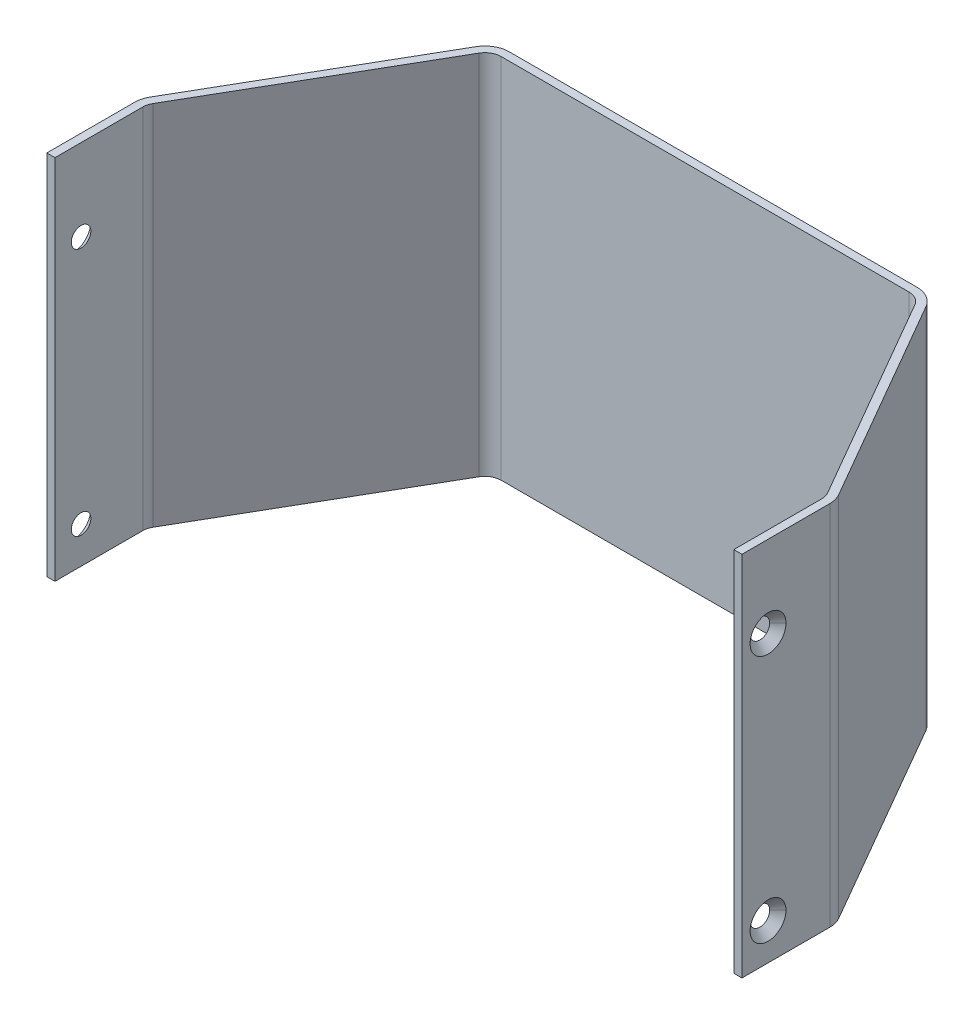
ISO-10303-21;
HEADER;
FILE_DESCRIPTION(('STEP AP214'),'2;1');
FILE_NAME('part.step','',(''),(''),'','','');
FILE_SCHEMA(('AUTOMOTIVE_DESIGN { 1 0 10303 214 1 1 1 1 }'));
ENDSEC;
DATA;
#1=APPLICATION_CONTEXT('core data for automotive mechanical design processes');
#2=APPLICATION_PROTOCOL_DEFINITION('international standard','automotive_design',2000,#1);
#3=PRODUCT_CONTEXT('',#1,'mechanical');
#4=PRODUCT('Part','Part','',(#3));
#5=PRODUCT_RELATED_PRODUCT_CATEGORY('part','',(#4));
#6=PRODUCT_DEFINITION_FORMATION('','',#4);
#7=PRODUCT_DEFINITION_CONTEXT('part definition',#1,'design');
#8=PRODUCT_DEFINITION('design','',#6,#7);
#9=PRODUCT_DEFINITION_SHAPE('','',#8);
#10=(LENGTH_UNIT() NAMED_UNIT(*) SI_UNIT(.MILLI.,.METRE.));
#11=(NAMED_UNIT(*) PLANE_ANGLE_UNIT() SI_UNIT($,.RADIAN.));
#12=(NAMED_UNIT(*) SI_UNIT($,.STERADIAN.) SOLID_ANGLE_UNIT());
#13=UNCERTAINTY_MEASURE_WITH_UNIT(LENGTH_MEASURE(1.E-05),#10,'distance_accuracy_value','');
#14=(GEOMETRIC_REPRESENTATION_CONTEXT(3) GLOBAL_UNCERTAINTY_ASSIGNED_CONTEXT((#13)) GLOBAL_UNIT_ASSIGNED_CONTEXT((#10,
#11,#12)) REPRESENTATION_CONTEXT('',''));
#15=CARTESIAN_POINT('',(0.,0.,0.));
#16=DIRECTION('',(0.,0.,1.));
#17=DIRECTION('',(1.,0.,0.));
#18=AXIS2_PLACEMENT_3D('',#15,#16,#17);
#19=CARTESIAN_POINT('',(42.625,35.,34.4));
#20=DIRECTION('',(1.,0.,0.));
#21=DIRECTION('',(0.,0.,-1.));
#22=AXIS2_PLACEMENT_3D('',#19,#20,#21);
#23=CONICAL_SURFACE('',#22,2.2,0.785398163397452);
#24=CARTESIAN_POINT('',(41.625,35.,34.4));
#25=DIRECTION('',(1.,0.,0.));
#26=DIRECTION('',(0.,0.,-1.));
#27=AXIS2_PLACEMENT_3D('',#24,#25,#26);
#28=CIRCLE('',#27,1.2);
#29=CARTESIAN_POINT('',(41.625,35.,35.6));
#30=VERTEX_POINT('',#29);
#31=CARTESIAN_POINT('',(41.625,35.,33.2));
#32=VERTEX_POINT('',#31);
#33=EDGE_CURVE('E41',#30,#32,#28,.T.);
#34=ORIENTED_EDGE('',*,*,#33,.F.);
#35=DIRECTION('',(0.707106781186545,0.,0.70710678118655));
#36=VECTOR('',#35,1.);
#37=CARTESIAN_POINT('',(42.625,35.,36.6));
#38=LINE('',#37,#36);
#39=CARTESIAN_POINT('',(42.625,35.,36.6));
#40=VERTEX_POINT('',#39);
#41=EDGE_CURVE('E11',#30,#40,#38,.T.);
#42=ORIENTED_EDGE('',*,*,#41,.T.);
#43=CARTESIAN_POINT('',(42.625,35.,34.4));
#44=DIRECTION('',(1.,0.,0.));
#45=DIRECTION('',(0.,0.,-1.));
#46=AXIS2_PLACEMENT_3D('',#43,#44,#45);
#47=CIRCLE('',#46,2.2);
#48=CARTESIAN_POINT('',(42.625,35.,32.2));
#49=VERTEX_POINT('',#48);
#50=EDGE_CURVE('E27',#40,#49,#47,.T.);
#51=ORIENTED_EDGE('',*,*,#50,.T.);
#52=DIRECTION('',(0.707106781186545,0.,-0.70710678118655));
#53=VECTOR('',#52,1.);
#54=CARTESIAN_POINT('',(42.625,35.,32.2));
#55=LINE('',#54,#53);
#56=EDGE_CURVE('E459',#32,#49,#55,.T.);
#57=ORIENTED_EDGE('',*,*,#56,.F.);
#58=EDGE_LOOP('',(#34,#42,#51,#57));
#59=FACE_BOUND('',#58,.T.);
#60=ADVANCED_FACE('F16',(#59),#23,.F.);
#61=CARTESIAN_POINT('',(42.625,4.5,34.4));
#62=DIRECTION('',(1.,0.,0.));
#63=DIRECTION('',(0.,0.,-1.));
#64=AXIS2_PLACEMENT_3D('',#61,#62,#63);
#65=CONICAL_SURFACE('',#64,2.2,0.785398163397453);
#66=CARTESIAN_POINT('',(41.625,4.5,34.4));
#67=DIRECTION('',(1.,0.,0.));
#68=DIRECTION('',(0.,0.,-1.));
#69=AXIS2_PLACEMENT_3D('',#66,#67,#68);
#70=CIRCLE('',#69,1.2);
#71=CARTESIAN_POINT('',(41.625,4.5,35.6));
#72=VERTEX_POINT('',#71);
#73=CARTESIAN_POINT('',(41.625,4.5,33.2));
#74=VERTEX_POINT('',#73);
#75=EDGE_CURVE('E350',#72,#74,#70,.T.);
#76=ORIENTED_EDGE('',*,*,#75,.F.);
#77=DIRECTION('',(0.707106781186544,0.,0.707106781186551));
#78=VECTOR('',#77,1.);
#79=CARTESIAN_POINT('',(42.625,4.5,36.6));
#80=LINE('',#79,#78);
#81=CARTESIAN_POINT('',(42.625,4.5,36.6));
#82=VERTEX_POINT('',#81);
#83=EDGE_CURVE('E356',#72,#82,#80,.T.);
#84=ORIENTED_EDGE('',*,*,#83,.T.);
#85=CARTESIAN_POINT('',(42.625,4.5,34.4));
#86=DIRECTION('',(1.,0.,0.));
#87=DIRECTION('',(0.,0.,-1.));
#88=AXIS2_PLACEMENT_3D('',#85,#86,#87);
#89=CIRCLE('',#88,2.2);
#90=CARTESIAN_POINT('',(42.625,4.5,32.2));
#91=VERTEX_POINT('',#90);
#92=EDGE_CURVE('E352',#82,#91,#89,.T.);
#93=ORIENTED_EDGE('',*,*,#92,.T.);
#94=DIRECTION('',(0.707106781186544,0.,-0.707106781186551));
#95=VECTOR('',#94,1.);
#96=CARTESIAN_POINT('',(42.625,4.5,32.2));
#97=LINE('',#96,#95);
#98=EDGE_CURVE('E391',#74,#91,#97,.T.);
#99=ORIENTED_EDGE('',*,*,#98,.F.);
#100=EDGE_LOOP('',(#76,#84,#93,#99));
#101=FACE_BOUND('',#100,.T.);
#102=ADVANCED_FACE('F857',(#101),#65,.F.);
#103=CARTESIAN_POINT('',(-42.625,35.,34.4));
#104=DIRECTION('',(-1.,0.,0.));
#105=DIRECTION('',(0.,0.,1.));
#106=AXIS2_PLACEMENT_3D('',#103,#104,#105);
#107=CONICAL_SURFACE('',#106,2.2,0.785398163397448);
#108=CARTESIAN_POINT('',(-41.625,35.,34.4));
#109=DIRECTION('',(-1.,0.,0.));
#110=DIRECTION('',(0.,0.,1.));
#111=AXIS2_PLACEMENT_3D('',#108,#109,#110);
#112=CIRCLE('',#111,1.2);
#113=CARTESIAN_POINT('',(-41.625,35.,33.2));
#114=VERTEX_POINT('',#113);
#115=CARTESIAN_POINT('',(-41.625,35.,35.6));
#116=VERTEX_POINT('',#115);
#117=EDGE_CURVE('E340',#114,#116,#112,.T.);
#118=ORIENTED_EDGE('',*,*,#117,.F.);
#119=DIRECTION('',(-0.707106781186547,0.,-0.707106781186548));
#120=VECTOR('',#119,1.);
#121=CARTESIAN_POINT('',(-42.625,35.,32.2));
#122=LINE('',#121,#120);
#123=CARTESIAN_POINT('',(-42.625,35.,32.2));
#124=VERTEX_POINT('',#123);
#125=EDGE_CURVE('E357',#114,#124,#122,.T.);
#126=ORIENTED_EDGE('',*,*,#125,.T.);
#127=CARTESIAN_POINT('',(-42.625,35.,34.4));
#128=DIRECTION('',(-1.,0.,0.));
#129=DIRECTION('',(0.,0.,1.));
#130=AXIS2_PLACEMENT_3D('',#127,#128,#129);
#131=CIRCLE('',#130,2.2);
#132=CARTESIAN_POINT('',(-42.625,35.,36.6));
#133=VERTEX_POINT('',#132);
#134=EDGE_CURVE('E405',#124,#133,#131,.T.);
#135=ORIENTED_EDGE('',*,*,#134,.T.);
#136=DIRECTION('',(-0.707106781186548,0.,0.707106781186547));
#137=VECTOR('',#136,1.);
#138=CARTESIAN_POINT('',(-42.625,35.,36.6));
#139=LINE('',#138,#137);
#140=EDGE_CURVE('E335',#116,#133,#139,.T.);
#141=ORIENTED_EDGE('',*,*,#140,.F.);
#142=EDGE_LOOP('',(#118,#126,#135,#141));
#143=FACE_BOUND('',#142,.T.);
#144=ADVANCED_FACE('F861',(#143),#107,.F.);
#145=CARTESIAN_POINT('',(-42.625,4.5,34.4));
#146=DIRECTION('',(-1.,0.,0.));
#147=DIRECTION('',(0.,0.,1.));
#148=AXIS2_PLACEMENT_3D('',#145,#146,#147);
#149=CONICAL_SURFACE('',#148,2.2,0.785398163397448);
#150=CARTESIAN_POINT('',(-41.625,4.5,34.4));
#151=DIRECTION('',(-1.,0.,0.));
#152=DIRECTION('',(0.,0.,1.));
#153=AXIS2_PLACEMENT_3D('',#150,#151,#152);
#154=CIRCLE('',#153,1.2);
#155=CARTESIAN_POINT('',(-41.625,4.5,33.2));
#156=VERTEX_POINT('',#155);
#157=CARTESIAN_POINT('',(-41.625,4.5,35.6));
#158=VERTEX_POINT('',#157);
#159=EDGE_CURVE('E306',#156,#158,#154,.T.);
#160=ORIENTED_EDGE('',*,*,#159,.F.);
#161=DIRECTION('',(-0.707106781186547,0.,-0.707106781186548));
#162=VECTOR('',#161,1.);
#163=CARTESIAN_POINT('',(-42.625,4.5,32.2));
#164=LINE('',#163,#162);
#165=CARTESIAN_POINT('',(-42.625,4.5,32.2));
#166=VERTEX_POINT('',#165);
#167=EDGE_CURVE('E413',#156,#166,#164,.T.);
#168=ORIENTED_EDGE('',*,*,#167,.T.);
#169=CARTESIAN_POINT('',(-42.625,4.5,34.4));
#170=DIRECTION('',(-1.,0.,0.));
#171=DIRECTION('',(0.,0.,1.));
#172=AXIS2_PLACEMENT_3D('',#169,#170,#171);
#173=CIRCLE('',#172,2.2);
#174=CARTESIAN_POINT('',(-42.625,4.5,36.6));
#175=VERTEX_POINT('',#174);
#176=EDGE_CURVE('E466',#166,#175,#173,.T.);
#177=ORIENTED_EDGE('',*,*,#176,.T.);
#178=DIRECTION('',(-0.707106781186548,0.,0.707106781186547));
#179=VECTOR('',#178,1.);
#180=CARTESIAN_POINT('',(-42.625,4.5,36.6));
#181=LINE('',#180,#179);
#182=EDGE_CURVE('E334',#158,#175,#181,.T.);
#183=ORIENTED_EDGE('',*,*,#182,.F.);
#184=EDGE_LOOP('',(#160,#168,#177,#183));
#185=FACE_BOUND('',#184,.T.);
#186=ADVANCED_FACE('F908',(#185),#149,.F.);
#187=CARTESIAN_POINT('',(-42.625,45.,26.831243060695));
#188=DIRECTION('',(1.,0.,0.));
#189=DIRECTION('',(0.,0.,1.));
#190=AXIS2_PLACEMENT_3D('',#187,#188,#189);
#191=PLANE('',#190);
#192=DIRECTION('',(0.,0.,1.));
#193=VECTOR('',#192,1.);
#194=CARTESIAN_POINT('',(-42.625,0.,26.831243060695));
#195=LINE('',#194,#193);
#196=CARTESIAN_POINT('',(-42.625,0.,26.831243060695));
#197=VERTEX_POINT('',#196);
#198=CARTESIAN_POINT('',(-42.625,0.,37.6));
#199=VERTEX_POINT('',#198);
#200=EDGE_CURVE('E361',#197,#199,#195,.T.);
#201=ORIENTED_EDGE('',*,*,#200,.T.);
#202=DIRECTION('',(0.,-1.,0.));
#203=VECTOR('',#202,1.);
#204=CARTESIAN_POINT('',(-42.625,45.,37.6));
#205=LINE('',#204,#203);
#206=CARTESIAN_POINT('',(-42.625,45.,37.6));
#207=VERTEX_POINT('',#206);
#208=EDGE_CURVE('E378',#207,#199,#205,.T.);
#209=ORIENTED_EDGE('',*,*,#208,.F.);
#210=DIRECTION('',(0.,0.,1.));
#211=VECTOR('',#210,1.);
#212=CARTESIAN_POINT('',(-42.625,45.,26.831243060695));
#213=LINE('',#212,#211);
#214=CARTESIAN_POINT('',(-42.625,45.,26.831243060695));
#215=VERTEX_POINT('',#214);
#216=EDGE_CURVE('E366',#215,#207,#213,.T.);
#217=ORIENTED_EDGE('',*,*,#216,.F.);
#218=DIRECTION('',(0.,-1.,0.));
#219=VECTOR('',#218,1.);
#220=CARTESIAN_POINT('',(-42.625,45.,26.831243060695));
#221=LINE('',#220,#219);
#222=EDGE_CURVE('E358',#215,#197,#221,.T.);
#223=ORIENTED_EDGE('',*,*,#222,.T.);
#224=EDGE_LOOP('',(#201,#209,#217,#223));
#225=FACE_BOUND('',#224,.T.);
#226=CARTESIAN_POINT('',(-42.625,35.,34.4));
#227=DIRECTION('',(-1.,0.,0.));
#228=DIRECTION('',(0.,0.,1.));
#229=AXIS2_PLACEMENT_3D('',#226,#227,#228);
#230=CIRCLE('',#229,2.2);
#231=EDGE_CURVE('E395',#133,#124,#230,.T.);
#232=ORIENTED_EDGE('',*,*,#231,.F.);
#233=ORIENTED_EDGE('',*,*,#134,.F.);
#234=EDGE_LOOP('',(#232,#233));
#235=FACE_BOUND('',#234,.T.);
#236=CARTESIAN_POINT('',(-42.625,4.5,34.4));
#237=DIRECTION('',(-1.,0.,0.));
#238=DIRECTION('',(0.,0.,1.));
#239=AXIS2_PLACEMENT_3D('',#236,#237,#238);
#240=CIRCLE('',#239,2.2);
#241=EDGE_CURVE('E330',#175,#166,#240,.T.);
#242=ORIENTED_EDGE('',*,*,#241,.F.);
#243=ORIENTED_EDGE('',*,*,#176,.F.);
#244=EDGE_LOOP('',(#242,#243));
#245=FACE_BOUND('',#244,.T.);
#246=ADVANCED_FACE('F605',(#225,#235,#245),#191,.F.);
#247=CARTESIAN_POINT('',(-41.625,45.,37.6));
#248=DIRECTION('',(0.,0.,1.));
#249=DIRECTION('',(1.,0.,0.));
#250=AXIS2_PLACEMENT_3D('',#247,#248,#249);
#251=PLANE('',#250);
#252=DIRECTION('',(-1.,0.,0.));
#253=VECTOR('',#252,1.);
#254=CARTESIAN_POINT('',(-41.625,0.,37.6));
#255=LINE('',#254,#253);
#256=CARTESIAN_POINT('',(-41.625,0.,37.6));
#257=VERTEX_POINT('',#256);
#258=EDGE_CURVE('E399',#257,#199,#255,.T.);
#259=ORIENTED_EDGE('',*,*,#258,.F.);
#260=DIRECTION('',(0.,-1.,0.));
#261=VECTOR('',#260,1.);
#262=CARTESIAN_POINT('',(-41.625,45.,37.6));
#263=LINE('',#262,#261);
#264=CARTESIAN_POINT('',(-41.625,45.,37.6));
#265=VERTEX_POINT('',#264);
#266=EDGE_CURVE('E430',#265,#257,#263,.T.);
#267=ORIENTED_EDGE('',*,*,#266,.F.);
#268=DIRECTION('',(-1.,0.,0.));
#269=VECTOR('',#268,1.);
#270=CARTESIAN_POINT('',(-41.625,45.,37.6));
#271=LINE('',#270,#269);
#272=EDGE_CURVE('E362',#265,#207,#271,.T.);
#273=ORIENTED_EDGE('',*,*,#272,.T.);
#274=ORIENTED_EDGE('',*,*,#208,.T.);
#275=EDGE_LOOP('',(#259,#267,#273,#274));
#276=FACE_BOUND('',#275,.T.);
#277=ADVANCED_FACE('F608',(#276),#251,.T.);
#278=CARTESIAN_POINT('',(-41.625,45.,26.831243060695));
#279=DIRECTION('',(1.,0.,0.));
#280=DIRECTION('',(0.,0.,1.));
#281=AXIS2_PLACEMENT_3D('',#278,#279,#280);
#282=PLANE('',#281);
#283=DIRECTION('',(0.,0.,1.));
#284=VECTOR('',#283,1.);
#285=CARTESIAN_POINT('',(-41.625,0.,26.831243060695));
#286=LINE('',#285,#284);
#287=CARTESIAN_POINT('',(-41.625,0.,26.831243060695));
#288=VERTEX_POINT('',#287);
#289=EDGE_CURVE('E493',#288,#257,#286,.T.);
#290=ORIENTED_EDGE('',*,*,#289,.F.);
#291=DIRECTION('',(0.,-1.,0.));
#292=VECTOR('',#291,1.);
#293=CARTESIAN_POINT('',(-41.625,45.,26.831243060695));
#294=LINE('',#293,#292);
#295=CARTESIAN_POINT('',(-41.625,45.,26.831243060695));
#296=VERTEX_POINT('',#295);
#297=EDGE_CURVE('E307',#296,#288,#294,.T.);
#298=ORIENTED_EDGE('',*,*,#297,.F.);
#299=DIRECTION('',(0.,0.,1.));
#300=VECTOR('',#299,1.);
#301=CARTESIAN_POINT('',(-41.625,45.,26.831243060695));
#302=LINE('',#301,#300);
#303=EDGE_CURVE('E381',#296,#265,#302,.T.);
#304=ORIENTED_EDGE('',*,*,#303,.T.);
#305=ORIENTED_EDGE('',*,*,#266,.T.);
#306=EDGE_LOOP('',(#290,#298,#304,#305));
#307=FACE_BOUND('',#306,.T.);
#308=CARTESIAN_POINT('',(-41.625,35.,34.4));
#309=DIRECTION('',(-1.,0.,0.));
#310=DIRECTION('',(0.,0.,1.));
#311=AXIS2_PLACEMENT_3D('',#308,#309,#310);
#312=CIRCLE('',#311,1.2);
#313=EDGE_CURVE('E433',#116,#114,#312,.T.);
#314=ORIENTED_EDGE('',*,*,#313,.T.);
#315=ORIENTED_EDGE('',*,*,#117,.T.);
#316=EDGE_LOOP('',(#314,#315));
#317=FACE_BOUND('',#316,.T.);
#318=CARTESIAN_POINT('',(-41.625,4.5,34.4));
#319=DIRECTION('',(-1.,0.,0.));
#320=DIRECTION('',(0.,0.,1.));
#321=AXIS2_PLACEMENT_3D('',#318,#319,#320);
#322=CIRCLE('',#321,1.2);
#323=EDGE_CURVE('E336',#158,#156,#322,.T.);
#324=ORIENTED_EDGE('',*,*,#323,.T.);
#325=ORIENTED_EDGE('',*,*,#159,.T.);
#326=EDGE_LOOP('',(#324,#325));
#327=FACE_BOUND('',#326,.T.);
#328=ADVANCED_FACE('F610',(#307,#317,#327),#282,.T.);
#329=CARTESIAN_POINT('',(-39.625,45.,26.831243060695));
#330=DIRECTION('',(0.,-1.,0.));
#331=DIRECTION('',(0.,0.,-1.));
#332=AXIS2_PLACEMENT_3D('',#329,#330,#331);
#333=CYLINDRICAL_SURFACE('',#332,1.99999999999965);
#334=CARTESIAN_POINT('',(-39.625,0.,26.831243060695));
#335=DIRECTION('',(0.,1.,0.));
#336=DIRECTION('',(1.,0.,0.));
#337=AXIS2_PLACEMENT_3D('',#334,#335,#336);
#338=CIRCLE('',#337,1.99999999999965);
#339=CARTESIAN_POINT('',(-41.3570508075686,0.,25.8312430606952));
#340=VERTEX_POINT('',#339);
#341=EDGE_CURVE('E488',#340,#288,#338,.T.);
#342=ORIENTED_EDGE('',*,*,#341,.F.);
#343=DIRECTION('',(0.,-1.,0.));
#344=VECTOR('',#343,1.);
#345=CARTESIAN_POINT('',(-41.3570508075686,45.,25.8312430606952));
#346=LINE('',#345,#344);
#347=CARTESIAN_POINT('',(-41.3570508075686,45.,25.8312430606952));
#348=VERTEX_POINT('',#347);
#349=EDGE_CURVE('E479',#348,#340,#346,.T.);
#350=ORIENTED_EDGE('',*,*,#349,.F.);
#351=CARTESIAN_POINT('',(-39.625,45.,26.831243060695));
#352=DIRECTION('',(0.,1.,0.));
#353=DIRECTION('',(1.,0.,0.));
#354=AXIS2_PLACEMENT_3D('',#351,#352,#353);
#355=CIRCLE('',#354,1.99999999999965);
#356=EDGE_CURVE('E303',#348,#296,#355,.T.);
#357=ORIENTED_EDGE('',*,*,#356,.T.);
#358=ORIENTED_EDGE('',*,*,#297,.T.);
#359=EDGE_LOOP('',(#342,#350,#357,#358));
#360=FACE_BOUND('',#359,.T.);
#361=ADVANCED_FACE('F612',(#360),#333,.F.);
#362=CARTESIAN_POINT('',(-41.3570508075683,45.,25.8312430606954));
#363=DIRECTION('',(0.86602540378444,0.,0.5));
#364=DIRECTION('',(0.,-1.,0.));
#365=AXIS2_PLACEMENT_3D('',#362,#363,#364);
#366=PLANE('',#365);
#367=DIRECTION('',(-0.5,0.,0.86602540378444));
#368=VECTOR('',#367,1.);
#369=CARTESIAN_POINT('',(-41.3570508075683,0.,25.8312430606954));
#370=LINE('',#369,#368);
#371=CARTESIAN_POINT('',(-26.7320508075683,0.,0.500000000000347));
#372=VERTEX_POINT('',#371);
#373=EDGE_CURVE('E192',#372,#340,#370,.T.);
#374=ORIENTED_EDGE('',*,*,#373,.F.);
#375=DIRECTION('',(0.,-1.,0.));
#376=VECTOR('',#375,1.);
#377=CARTESIAN_POINT('',(-26.7320508075683,45.,0.500000000000347));
#378=LINE('',#377,#376);
#379=CARTESIAN_POINT('',(-26.7320508075683,45.,0.500000000000347));
#380=VERTEX_POINT('',#379);
#381=EDGE_CURVE('E204',#380,#372,#378,.T.);
#382=ORIENTED_EDGE('',*,*,#381,.F.);
#383=DIRECTION('',(-0.5,0.,0.86602540378444));
#384=VECTOR('',#383,1.);
#385=CARTESIAN_POINT('',(-41.3570508075683,45.,25.8312430606954));
#386=LINE('',#385,#384);
#387=EDGE_CURVE('E515',#380,#348,#386,.T.);
#388=ORIENTED_EDGE('',*,*,#387,.T.);
#389=ORIENTED_EDGE('',*,*,#349,.T.);
#390=EDGE_LOOP('',(#374,#382,#388,#389));
#391=FACE_BOUND('',#390,.T.);
#392=ADVANCED_FACE('F871',(#391),#366,.T.);
#393=CARTESIAN_POINT('',(-25.,45.,1.5));
#394=DIRECTION('',(0.,-1.,0.));
#395=DIRECTION('',(0.,0.,-1.));
#396=AXIS2_PLACEMENT_3D('',#393,#394,#395);
#397=CYLINDRICAL_SURFACE('',#396,1.99999999999965);
#398=CARTESIAN_POINT('',(-25.,0.,1.5));
#399=DIRECTION('',(0.,1.,0.));
#400=DIRECTION('',(1.,0.,0.));
#401=AXIS2_PLACEMENT_3D('',#398,#399,#400);
#402=CIRCLE('',#401,1.99999999999965);
#403=CARTESIAN_POINT('',(-25.,0.,-0.499999999999652));
#404=VERTEX_POINT('',#403);
#405=EDGE_CURVE('E273',#404,#372,#402,.T.);
#406=ORIENTED_EDGE('',*,*,#405,.F.);
#407=DIRECTION('',(0.,-1.,0.));
#408=VECTOR('',#407,1.);
#409=CARTESIAN_POINT('',(-25.,45.,-0.499999999999652));
#410=LINE('',#409,#408);
#411=CARTESIAN_POINT('',(-25.,45.,-0.499999999999652));
#412=VERTEX_POINT('',#411);
#413=EDGE_CURVE('E267',#412,#404,#410,.T.);
#414=ORIENTED_EDGE('',*,*,#413,.F.);
#415=CARTESIAN_POINT('',(-25.,45.,1.5));
#416=DIRECTION('',(0.,1.,0.));
#417=DIRECTION('',(1.,0.,0.));
#418=AXIS2_PLACEMENT_3D('',#415,#416,#417);
#419=CIRCLE('',#418,1.99999999999965);
#420=EDGE_CURVE('E472',#412,#380,#419,.T.);
#421=ORIENTED_EDGE('',*,*,#420,.T.);
#422=ORIENTED_EDGE('',*,*,#381,.T.);
#423=EDGE_LOOP('',(#406,#414,#421,#422));
#424=FACE_BOUND('',#423,.T.);
#425=ADVANCED_FACE('F867',(#424),#397,.F.);
#426=CARTESIAN_POINT('',(-25.,45.,-0.5));
#427=DIRECTION('',(0.,0.,1.));
#428=DIRECTION('',(1.,0.,0.));
#429=AXIS2_PLACEMENT_3D('',#426,#427,#428);
#430=PLANE('',#429);
#431=DIRECTION('',(-1.,0.,0.));
#432=VECTOR('',#431,1.);
#433=CARTESIAN_POINT('',(-25.,0.,-0.5));
#434=LINE('',#433,#432);
#435=CARTESIAN_POINT('',(25.,0.,-0.5));
#436=VERTEX_POINT('',#435);
#437=EDGE_CURVE('E261',#436,#404,#434,.T.);
#438=ORIENTED_EDGE('',*,*,#437,.F.);
#439=DIRECTION('',(0.,-1.,0.));
#440=VECTOR('',#439,1.);
#441=CARTESIAN_POINT('',(25.,45.,-0.5));
#442=LINE('',#441,#440);
#443=CARTESIAN_POINT('',(25.,45.,-0.5));
#444=VERTEX_POINT('',#443);
#445=EDGE_CURVE('E265',#444,#436,#442,.T.);
#446=ORIENTED_EDGE('',*,*,#445,.F.);
#447=DIRECTION('',(-1.,0.,0.));
#448=VECTOR('',#447,1.);
#449=CARTESIAN_POINT('',(-25.,45.,-0.5));
#450=LINE('',#449,#448);
#451=EDGE_CURVE('E301',#444,#412,#450,.T.);
#452=ORIENTED_EDGE('',*,*,#451,.T.);
#453=ORIENTED_EDGE('',*,*,#413,.T.);
#454=EDGE_LOOP('',(#438,#446,#452,#453));
#455=FACE_BOUND('',#454,.T.);
#456=ADVANCED_FACE('F263',(#455),#430,.T.);
#457=CARTESIAN_POINT('',(25.,45.,1.5));
#458=DIRECTION('',(0.,-1.,0.));
#459=DIRECTION('',(0.,0.,-1.));
#460=AXIS2_PLACEMENT_3D('',#457,#458,#459);
#461=CYLINDRICAL_SURFACE('',#460,2.00000000000018);
#462=CARTESIAN_POINT('',(25.,0.,1.5));
#463=DIRECTION('',(0.,1.,0.));
#464=DIRECTION('',(1.,0.,0.));
#465=AXIS2_PLACEMENT_3D('',#462,#463,#464);
#466=CIRCLE('',#465,2.00000000000018);
#467=CARTESIAN_POINT('',(26.732050807569,0.,0.499999999999915));
#468=VERTEX_POINT('',#467);
#469=EDGE_CURVE('E272',#468,#436,#466,.T.);
#470=ORIENTED_EDGE('',*,*,#469,.F.);
#471=DIRECTION('',(0.,-1.,0.));
#472=VECTOR('',#471,1.);
#473=CARTESIAN_POINT('',(26.732050807569,45.,0.499999999999915));
#474=LINE('',#473,#472);
#475=CARTESIAN_POINT('',(26.732050807569,45.,0.499999999999915));
#476=VERTEX_POINT('',#475);
#477=EDGE_CURVE('E316',#476,#468,#474,.T.);
#478=ORIENTED_EDGE('',*,*,#477,.F.);
#479=CARTESIAN_POINT('',(25.,45.,1.5));
#480=DIRECTION('',(0.,1.,0.));
#481=DIRECTION('',(1.,0.,0.));
#482=AXIS2_PLACEMENT_3D('',#479,#480,#481);
#483=CIRCLE('',#482,2.00000000000018);
#484=EDGE_CURVE('E281',#476,#444,#483,.T.);
#485=ORIENTED_EDGE('',*,*,#484,.T.);
#486=ORIENTED_EDGE('',*,*,#445,.T.);
#487=EDGE_LOOP('',(#470,#478,#485,#486));
#488=FACE_BOUND('',#487,.T.);
#489=ADVANCED_FACE('F278',(#488),#461,.F.);
#490=CARTESIAN_POINT('',(26.7320508075692,45.,0.499999999999825));
#491=DIRECTION('',(-0.86602540378444,0.,0.5));
#492=DIRECTION('',(0.,1.,0.));
#493=AXIS2_PLACEMENT_3D('',#490,#491,#492);
#494=PLANE('',#493);
#495=DIRECTION('',(-0.5,0.,-0.86602540378444));
#496=VECTOR('',#495,1.);
#497=CARTESIAN_POINT('',(26.7320508075692,0.,0.499999999999825));
#498=LINE('',#497,#496);
#499=CARTESIAN_POINT('',(41.3570508075695,0.,25.8312430606954));
#500=VERTEX_POINT('',#499);
#501=EDGE_CURVE('E289',#500,#468,#498,.T.);
#502=ORIENTED_EDGE('',*,*,#501,.F.);
#503=DIRECTION('',(0.,-1.,0.));
#504=VECTOR('',#503,1.);
#505=CARTESIAN_POINT('',(41.3570508075695,45.,25.8312430606954));
#506=LINE('',#505,#504);
#507=CARTESIAN_POINT('',(41.3570508075695,45.,25.8312430606954));
#508=VERTEX_POINT('',#507);
#509=EDGE_CURVE('E317',#508,#500,#506,.T.);
#510=ORIENTED_EDGE('',*,*,#509,.F.);
#511=DIRECTION('',(-0.5,0.,-0.86602540378444));
#512=VECTOR('',#511,1.);
#513=CARTESIAN_POINT('',(26.7320508075692,45.,0.499999999999825));
#514=LINE('',#513,#512);
#515=EDGE_CURVE('E283',#508,#476,#514,.T.);
#516=ORIENTED_EDGE('',*,*,#515,.T.);
#517=ORIENTED_EDGE('',*,*,#477,.T.);
#518=EDGE_LOOP('',(#502,#510,#516,#517));
#519=FACE_BOUND('',#518,.T.);
#520=ADVANCED_FACE('F919',(#519),#494,.T.);
#521=CARTESIAN_POINT('',(39.625,45.,26.831243060695));
#522=DIRECTION('',(0.,-1.,0.));
#523=DIRECTION('',(0.,0.,-1.));
#524=AXIS2_PLACEMENT_3D('',#521,#522,#523);
#525=CYLINDRICAL_SURFACE('',#524,2.00000000000018);
#526=CARTESIAN_POINT('',(39.625,0.,26.831243060695));
#527=DIRECTION('',(0.,1.,0.));
#528=DIRECTION('',(1.,0.,0.));
#529=AXIS2_PLACEMENT_3D('',#526,#527,#528);
#530=CIRCLE('',#529,2.00000000000018);
#531=CARTESIAN_POINT('',(41.625,0.,26.831243060695));
#532=VERTEX_POINT('',#531);
#533=EDGE_CURVE('E297',#532,#500,#530,.T.);
#534=ORIENTED_EDGE('',*,*,#533,.F.);
#535=DIRECTION('',(0.,-1.,0.));
#536=VECTOR('',#535,1.);
#537=CARTESIAN_POINT('',(41.625,45.,26.831243060695));
#538=LINE('',#537,#536);
#539=CARTESIAN_POINT('',(41.625,45.,26.831243060695));
#540=VERTEX_POINT('',#539);
#541=EDGE_CURVE('E324',#540,#532,#538,.T.);
#542=ORIENTED_EDGE('',*,*,#541,.F.);
#543=CARTESIAN_POINT('',(39.625,45.,26.831243060695));
#544=DIRECTION('',(0.,1.,0.));
#545=DIRECTION('',(1.,0.,0.));
#546=AXIS2_PLACEMENT_3D('',#543,#544,#545);
#547=CIRCLE('',#546,2.00000000000018);
#548=EDGE_CURVE('E312',#540,#508,#547,.T.);
#549=ORIENTED_EDGE('',*,*,#548,.T.);
#550=ORIENTED_EDGE('',*,*,#509,.T.);
#551=EDGE_LOOP('',(#534,#542,#549,#550));
#552=FACE_BOUND('',#551,.T.);
#553=ADVANCED_FACE('F914',(#552),#525,.F.);
#554=CARTESIAN_POINT('',(41.625,45.,26.831243060695));
#555=DIRECTION('',(-1.,0.,0.));
#556=DIRECTION('',(0.,0.,1.));
#557=AXIS2_PLACEMENT_3D('',#554,#555,#556);
#558=PLANE('',#557);
#559=DIRECTION('',(0.,0.,-1.));
#560=VECTOR('',#559,1.);
#561=CARTESIAN_POINT('',(41.625,0.,26.831243060695));
#562=LINE('',#561,#560);
#563=CARTESIAN_POINT('',(41.625,0.,37.6));
#564=VERTEX_POINT('',#563);
#565=EDGE_CURVE('E429',#564,#532,#562,.T.);
#566=ORIENTED_EDGE('',*,*,#565,.F.);
#567=DIRECTION('',(0.,-1.,0.));
#568=VECTOR('',#567,1.);
#569=CARTESIAN_POINT('',(41.625,45.,37.6));
#570=LINE('',#569,#568);
#571=CARTESIAN_POINT('',(41.625,45.,37.6));
#572=VERTEX_POINT('',#571);
#573=EDGE_CURVE('E351',#572,#564,#570,.T.);
#574=ORIENTED_EDGE('',*,*,#573,.F.);
#575=DIRECTION('',(0.,0.,-1.));
#576=VECTOR('',#575,1.);
#577=CARTESIAN_POINT('',(41.625,45.,26.831243060695));
#578=LINE('',#577,#576);
#579=EDGE_CURVE('E328',#572,#540,#578,.T.);
#580=ORIENTED_EDGE('',*,*,#579,.T.);
#581=ORIENTED_EDGE('',*,*,#541,.T.);
#582=EDGE_LOOP('',(#566,#574,#580,#581));
#583=FACE_BOUND('',#582,.T.);
#584=CARTESIAN_POINT('',(41.625,35.,34.4));
#585=DIRECTION('',(1.,0.,0.));
#586=DIRECTION('',(0.,0.,-1.));
#587=AXIS2_PLACEMENT_3D('',#584,#585,#586);
#588=CIRCLE('',#587,1.2);
#589=EDGE_CURVE('E329',#32,#30,#588,.T.);
#590=ORIENTED_EDGE('',*,*,#589,.T.);
#591=ORIENTED_EDGE('',*,*,#33,.T.);
#592=EDGE_LOOP('',(#590,#591));
#593=FACE_BOUND('',#592,.T.);
#594=CARTESIAN_POINT('',(41.625,4.5,34.4));
#595=DIRECTION('',(1.,0.,0.));
#596=DIRECTION('',(0.,0.,-1.));
#597=AXIS2_PLACEMENT_3D('',#594,#595,#596);
#598=CIRCLE('',#597,1.2);
#599=EDGE_CURVE('E387',#74,#72,#598,.T.);
#600=ORIENTED_EDGE('',*,*,#599,.T.);
#601=ORIENTED_EDGE('',*,*,#75,.T.);
#602=EDGE_LOOP('',(#600,#601));
#603=FACE_BOUND('',#602,.T.);
#604=ADVANCED_FACE('F918',(#583,#593,#603),#558,.T.);
#605=CARTESIAN_POINT('',(42.625,45.,37.6));
#606=DIRECTION('',(0.,0.,1.));
#607=DIRECTION('',(1.,0.,0.));
#608=AXIS2_PLACEMENT_3D('',#605,#606,#607);
#609=PLANE('',#608);
#610=DIRECTION('',(-1.,0.,0.));
#611=VECTOR('',#610,1.);
#612=CARTESIAN_POINT('',(42.625,0.,37.6));
#613=LINE('',#612,#611);
#614=CARTESIAN_POINT('',(42.625,0.,37.6));
#615=VERTEX_POINT('',#614);
#616=EDGE_CURVE('E425',#615,#564,#613,.T.);
#617=ORIENTED_EDGE('',*,*,#616,.F.);
#618=DIRECTION('',(0.,-1.,0.));
#619=VECTOR('',#618,1.);
#620=CARTESIAN_POINT('',(42.625,45.,37.6));
#621=LINE('',#620,#619);
#622=CARTESIAN_POINT('',(42.625,45.,37.6));
#623=VERTEX_POINT('',#622);
#624=EDGE_CURVE('E420',#623,#615,#621,.T.);
#625=ORIENTED_EDGE('',*,*,#624,.F.);
#626=DIRECTION('',(-1.,0.,0.));
#627=VECTOR('',#626,1.);
#628=CARTESIAN_POINT('',(42.625,45.,37.6));
#629=LINE('',#628,#627);
#630=EDGE_CURVE('E346',#623,#572,#629,.T.);
#631=ORIENTED_EDGE('',*,*,#630,.T.);
#632=ORIENTED_EDGE('',*,*,#573,.T.);
#633=EDGE_LOOP('',(#617,#625,#631,#632));
#634=FACE_BOUND('',#633,.T.);
#635=ADVANCED_FACE('F986',(#634),#609,.T.);
#636=CARTESIAN_POINT('',(42.625,45.,26.831243060695));
#637=DIRECTION('',(-1.,0.,0.));
#638=DIRECTION('',(0.,0.,1.));
#639=AXIS2_PLACEMENT_3D('',#636,#637,#638);
#640=PLANE('',#639);
#641=DIRECTION('',(0.,0.,-1.));
#642=VECTOR('',#641,1.);
#643=CARTESIAN_POINT('',(42.625,0.,26.831243060695));
#644=LINE('',#643,#642);
#645=CARTESIAN_POINT('',(42.625,0.,26.831243060695));
#646=VERTEX_POINT('',#645);
#647=EDGE_CURVE('E424',#615,#646,#644,.T.);
#648=ORIENTED_EDGE('',*,*,#647,.T.);
#649=DIRECTION('',(0.,-1.,0.));
#650=VECTOR('',#649,1.);
#651=CARTESIAN_POINT('',(42.625,45.,26.831243060695));
#652=LINE('',#651,#650);
#653=CARTESIAN_POINT('',(42.625,45.,26.831243060695));
#654=VERTEX_POINT('',#653);
#655=EDGE_CURVE('E341',#654,#646,#652,.T.);
#656=ORIENTED_EDGE('',*,*,#655,.F.);
#657=DIRECTION('',(0.,0.,-1.));
#658=VECTOR('',#657,1.);
#659=CARTESIAN_POINT('',(42.625,45.,26.831243060695));
#660=LINE('',#659,#658);
#661=EDGE_CURVE('E363',#623,#654,#660,.T.);
#662=ORIENTED_EDGE('',*,*,#661,.F.);
#663=ORIENTED_EDGE('',*,*,#624,.T.);
#664=EDGE_LOOP('',(#648,#656,#662,#663));
#665=FACE_BOUND('',#664,.T.);
#666=CARTESIAN_POINT('',(42.625,35.,34.4));
#667=DIRECTION('',(1.,0.,0.));
#668=DIRECTION('',(0.,0.,-1.));
#669=AXIS2_PLACEMENT_3D('',#666,#667,#668);
#670=CIRCLE('',#669,2.2);
#671=EDGE_CURVE('E492',#49,#40,#670,.T.);
#672=ORIENTED_EDGE('',*,*,#671,.F.);
#673=ORIENTED_EDGE('',*,*,#50,.F.);
#674=EDGE_LOOP('',(#672,#673));
#675=FACE_BOUND('',#674,.T.);
#676=CARTESIAN_POINT('',(42.625,4.5,34.4));
#677=DIRECTION('',(1.,0.,0.));
#678=DIRECTION('',(0.,0.,-1.));
#679=AXIS2_PLACEMENT_3D('',#676,#677,#678);
#680=CIRCLE('',#679,2.2);
#681=EDGE_CURVE('E396',#91,#82,#680,.T.);
#682=ORIENTED_EDGE('',*,*,#681,.F.);
#683=ORIENTED_EDGE('',*,*,#92,.F.);
#684=EDGE_LOOP('',(#682,#683));
#685=FACE_BOUND('',#684,.T.);
#686=ADVANCED_FACE('F882',(#665,#675,#685),#640,.F.);
#687=CARTESIAN_POINT('',(39.625,45.,26.831243060695));
#688=DIRECTION('',(0.,-1.,0.));
#689=DIRECTION('',(0.,0.,-1.));
#690=AXIS2_PLACEMENT_3D('',#687,#688,#689);
#691=CYLINDRICAL_SURFACE('',#690,3.00000000000018);
#692=CARTESIAN_POINT('',(39.625,0.,26.831243060695));
#693=DIRECTION('',(0.,1.,0.));
#694=DIRECTION('',(0.,0.,-1.));
#695=AXIS2_PLACEMENT_3D('',#692,#693,#694);
#696=CIRCLE('',#695,3.00000000000018);
#697=CARTESIAN_POINT('',(42.2230762113538,0.,25.3312430606954));
#698=VERTEX_POINT('',#697);
#699=EDGE_CURVE('E344',#646,#698,#696,.T.);
#700=ORIENTED_EDGE('',*,*,#699,.T.);
#701=DIRECTION('',(0.,-1.,0.));
#702=VECTOR('',#701,1.);
#703=CARTESIAN_POINT('',(42.2230762113538,45.,25.3312430606954));
#704=LINE('',#703,#702);
#705=CARTESIAN_POINT('',(42.2230762113538,45.,25.3312430606954));
#706=VERTEX_POINT('',#705);
#707=EDGE_CURVE('E538',#706,#698,#704,.T.);
#708=ORIENTED_EDGE('',*,*,#707,.F.);
#709=CARTESIAN_POINT('',(39.625,45.,26.831243060695));
#710=DIRECTION('',(0.,1.,0.));
#711=DIRECTION('',(0.,0.,-1.));
#712=AXIS2_PLACEMENT_3D('',#709,#710,#711);
#713=CIRCLE('',#712,3.00000000000018);
#714=EDGE_CURVE('E236',#654,#706,#713,.T.);
#715=ORIENTED_EDGE('',*,*,#714,.F.);
#716=ORIENTED_EDGE('',*,*,#655,.T.);
#717=EDGE_LOOP('',(#700,#708,#715,#716));
#718=FACE_BOUND('',#717,.T.);
#719=ADVANCED_FACE('F877',(#718),#691,.T.);
#720=CARTESIAN_POINT('',(27.5980762113536,45.,-1.72821826294189E-13));
#721=DIRECTION('',(-0.86602540378444,0.,0.5));
#722=DIRECTION('',(0.,1.,0.));
#723=AXIS2_PLACEMENT_3D('',#720,#721,#722);
#724=PLANE('',#723);
#725=DIRECTION('',(-0.5,0.,-0.86602540378444));
#726=VECTOR('',#725,1.);
#727=CARTESIAN_POINT('',(27.5980762113536,0.,-1.72821826294189E-13));
#728=LINE('',#727,#726);
#729=CARTESIAN_POINT('',(27.5980762113536,0.,-1.72821826294189E-13));
#730=VERTEX_POINT('',#729);
#731=EDGE_CURVE('E345',#698,#730,#728,.T.);
#732=ORIENTED_EDGE('',*,*,#731,.T.);
#733=DIRECTION('',(0.,-1.,0.));
#734=VECTOR('',#733,1.);
#735=CARTESIAN_POINT('',(27.5980762113536,45.,-1.72821826294189E-13));
#736=LINE('',#735,#734);
#737=CARTESIAN_POINT('',(27.5980762113536,45.,-1.72821826294189E-13));
#738=VERTEX_POINT('',#737);
#739=EDGE_CURVE('E223',#738,#730,#736,.T.);
#740=ORIENTED_EDGE('',*,*,#739,.F.);
#741=DIRECTION('',(-0.5,0.,-0.86602540378444));
#742=VECTOR('',#741,1.);
#743=CARTESIAN_POINT('',(27.5980762113536,45.,-1.72821826294189E-13));
#744=LINE('',#743,#742);
#745=EDGE_CURVE('E384',#706,#738,#744,.T.);
#746=ORIENTED_EDGE('',*,*,#745,.F.);
#747=ORIENTED_EDGE('',*,*,#707,.T.);
#748=EDGE_LOOP('',(#732,#740,#746,#747));
#749=FACE_BOUND('',#748,.T.);
#750=ADVANCED_FACE('F881',(#749),#724,.F.);
#751=CARTESIAN_POINT('',(25.,45.,1.5));
#752=DIRECTION('',(0.,-1.,0.));
#753=DIRECTION('',(0.,0.,-1.));
#754=AXIS2_PLACEMENT_3D('',#751,#752,#753);
#755=CYLINDRICAL_SURFACE('',#754,3.00000000000018);
#756=CARTESIAN_POINT('',(25.,0.,1.5));
#757=DIRECTION('',(0.,1.,0.));
#758=DIRECTION('',(0.,0.,-1.));
#759=AXIS2_PLACEMENT_3D('',#756,#757,#758);
#760=CIRCLE('',#759,3.00000000000018);
#761=CARTESIAN_POINT('',(25.,0.,-1.50000000000018));
#762=VERTEX_POINT('',#761);
#763=EDGE_CURVE('E20',#730,#762,#760,.T.);
#764=ORIENTED_EDGE('',*,*,#763,.T.);
#765=DIRECTION('',(0.,-1.,0.));
#766=VECTOR('',#765,1.);
#767=CARTESIAN_POINT('',(25.,45.,-1.50000000000018));
#768=LINE('',#767,#766);
#769=CARTESIAN_POINT('',(25.,45.,-1.50000000000018));
#770=VERTEX_POINT('',#769);
#771=EDGE_CURVE('E473',#770,#762,#768,.T.);
#772=ORIENTED_EDGE('',*,*,#771,.F.);
#773=CARTESIAN_POINT('',(25.,45.,1.5));
#774=DIRECTION('',(0.,1.,0.));
#775=DIRECTION('',(0.,0.,-1.));
#776=AXIS2_PLACEMENT_3D('',#773,#774,#775);
#777=CIRCLE('',#776,3.00000000000018);
#778=EDGE_CURVE('E507',#738,#770,#777,.T.);
#779=ORIENTED_EDGE('',*,*,#778,.F.);
#780=ORIENTED_EDGE('',*,*,#739,.T.);
#781=EDGE_LOOP('',(#764,#772,#779,#780));
#782=FACE_BOUND('',#781,.T.);
#783=ADVANCED_FACE('F1050',(#782),#755,.T.);
#784=CARTESIAN_POINT('',(-25.,45.,-1.5));
#785=DIRECTION('',(0.,0.,1.));
#786=DIRECTION('',(1.,0.,0.));
#787=AXIS2_PLACEMENT_3D('',#784,#785,#786);
#788=PLANE('',#787);
#789=DIRECTION('',(-1.,0.,0.));
#790=VECTOR('',#789,1.);
#791=CARTESIAN_POINT('',(-25.,0.,-1.5));
#792=LINE('',#791,#790);
#793=CARTESIAN_POINT('',(-25.,0.,-1.5));
#794=VERTEX_POINT('',#793);
#795=EDGE_CURVE('E476',#762,#794,#792,.T.);
#796=ORIENTED_EDGE('',*,*,#795,.T.);
#797=DIRECTION('',(0.,-1.,0.));
#798=VECTOR('',#797,1.);
#799=CARTESIAN_POINT('',(-25.,45.,-1.5));
#800=LINE('',#799,#798);
#801=CARTESIAN_POINT('',(-25.,45.,-1.5));
#802=VERTEX_POINT('',#801);
#803=EDGE_CURVE('E371',#802,#794,#800,.T.);
#804=ORIENTED_EDGE('',*,*,#803,.F.);
#805=DIRECTION('',(-1.,0.,0.));
#806=VECTOR('',#805,1.);
#807=CARTESIAN_POINT('',(-25.,45.,-1.5));
#808=LINE('',#807,#806);
#809=EDGE_CURVE('E510',#770,#802,#808,.T.);
#810=ORIENTED_EDGE('',*,*,#809,.F.);
#811=ORIENTED_EDGE('',*,*,#771,.T.);
#812=EDGE_LOOP('',(#796,#804,#810,#811));
#813=FACE_BOUND('',#812,.T.);
#814=ADVANCED_FACE('F966',(#813),#788,.F.);
#815=CARTESIAN_POINT('',(-25.,45.,1.5));
#816=DIRECTION('',(0.,-1.,0.));
#817=DIRECTION('',(0.,0.,-1.));
#818=AXIS2_PLACEMENT_3D('',#815,#816,#817);
#819=CYLINDRICAL_SURFACE('',#818,2.99999999999966);
#820=CARTESIAN_POINT('',(-25.,0.,1.5));
#821=DIRECTION('',(0.,1.,0.));
#822=DIRECTION('',(0.,0.,-1.));
#823=AXIS2_PLACEMENT_3D('',#820,#821,#822);
#824=CIRCLE('',#823,2.99999999999966);
#825=CARTESIAN_POINT('',(-27.598076211353,0.,1.82796486281056E-13));
#826=VERTEX_POINT('',#825);
#827=EDGE_CURVE('E409',#794,#826,#824,.T.);
#828=ORIENTED_EDGE('',*,*,#827,.T.);
#829=DIRECTION('',(0.,-1.,0.));
#830=VECTOR('',#829,1.);
#831=CARTESIAN_POINT('',(-27.598076211353,45.,1.82796486281056E-13));
#832=LINE('',#831,#830);
#833=CARTESIAN_POINT('',(-27.598076211353,45.,1.82796486281056E-13));
#834=VERTEX_POINT('',#833);
#835=EDGE_CURVE('E322',#834,#826,#832,.T.);
#836=ORIENTED_EDGE('',*,*,#835,.F.);
#837=CARTESIAN_POINT('',(-25.,45.,1.5));
#838=DIRECTION('',(0.,1.,0.));
#839=DIRECTION('',(0.,0.,-1.));
#840=AXIS2_PLACEMENT_3D('',#837,#838,#839);
#841=CIRCLE('',#840,2.99999999999966);
#842=EDGE_CURVE('E526',#802,#834,#841,.T.);
#843=ORIENTED_EDGE('',*,*,#842,.F.);
#844=ORIENTED_EDGE('',*,*,#803,.T.);
#845=EDGE_LOOP('',(#828,#836,#843,#844));
#846=FACE_BOUND('',#845,.T.);
#847=ADVANCED_FACE('F592',(#846),#819,.T.);
#848=CARTESIAN_POINT('',(-42.2230762113527,45.,25.3312430606953));
#849=DIRECTION('',(0.86602540378444,0.,0.5));
#850=DIRECTION('',(0.,-1.,0.));
#851=AXIS2_PLACEMENT_3D('',#848,#849,#850);
#852=PLANE('',#851);
#853=DIRECTION('',(-0.5,0.,0.86602540378444));
#854=VECTOR('',#853,1.);
#855=CARTESIAN_POINT('',(-42.2230762113527,0.,25.3312430606953));
#856=LINE('',#855,#854);
#857=CARTESIAN_POINT('',(-42.2230762113527,0.,25.3312430606953));
#858=VERTEX_POINT('',#857);
#859=EDGE_CURVE('E367',#826,#858,#856,.T.);
#860=ORIENTED_EDGE('',*,*,#859,.T.);
#861=DIRECTION('',(0.,-1.,0.));
#862=VECTOR('',#861,1.);
#863=CARTESIAN_POINT('',(-42.2230762113527,45.,25.3312430606953));
#864=LINE('',#863,#862);
#865=CARTESIAN_POINT('',(-42.2230762113527,45.,25.3312430606953));
#866=VERTEX_POINT('',#865);
#867=EDGE_CURVE('E323',#866,#858,#864,.T.);
#868=ORIENTED_EDGE('',*,*,#867,.F.);
#869=DIRECTION('',(-0.5,0.,0.86602540378444));
#870=VECTOR('',#869,1.);
#871=CARTESIAN_POINT('',(-42.2230762113527,45.,25.3312430606953));
#872=LINE('',#871,#870);
#873=EDGE_CURVE('E533',#834,#866,#872,.T.);
#874=ORIENTED_EDGE('',*,*,#873,.F.);
#875=ORIENTED_EDGE('',*,*,#835,.T.);
#876=EDGE_LOOP('',(#860,#868,#874,#875));
#877=FACE_BOUND('',#876,.T.);
#878=ADVANCED_FACE('F587',(#877),#852,.F.);
#879=CARTESIAN_POINT('',(-39.625,45.,26.831243060695));
#880=DIRECTION('',(0.,-1.,0.));
#881=DIRECTION('',(0.,0.,-1.));
#882=AXIS2_PLACEMENT_3D('',#879,#880,#881);
#883=CYLINDRICAL_SURFACE('',#882,2.99999999999965);
#884=CARTESIAN_POINT('',(-39.625,0.,26.831243060695));
#885=DIRECTION('',(0.,1.,0.));
#886=DIRECTION('',(0.,0.,-1.));
#887=AXIS2_PLACEMENT_3D('',#884,#885,#886);
#888=CIRCLE('',#887,2.99999999999965);
#889=EDGE_CURVE('E318',#858,#197,#888,.T.);
#890=ORIENTED_EDGE('',*,*,#889,.T.);
#891=ORIENTED_EDGE('',*,*,#222,.F.);
#892=CARTESIAN_POINT('',(-39.625,45.,26.831243060695));
#893=DIRECTION('',(0.,1.,0.));
#894=DIRECTION('',(0.,0.,-1.));
#895=AXIS2_PLACEMENT_3D('',#892,#893,#894);
#896=CIRCLE('',#895,2.99999999999965);
#897=EDGE_CURVE('E428',#866,#215,#896,.T.);
#898=ORIENTED_EDGE('',*,*,#897,.F.);
#899=ORIENTED_EDGE('',*,*,#867,.T.);
#900=EDGE_LOOP('',(#890,#891,#898,#899));
#901=FACE_BOUND('',#900,.T.);
#902=ADVANCED_FACE('F597',(#901),#883,.T.);
#903=CARTESIAN_POINT('',(-39.625,45.,26.831243060695));
#904=DIRECTION('',(0.,1.,0.));
#905=DIRECTION('',(1.,0.,0.));
#906=AXIS2_PLACEMENT_3D('',#903,#904,#905);
#907=PLANE('',#906);
#908=ORIENTED_EDGE('',*,*,#216,.T.);
#909=ORIENTED_EDGE('',*,*,#272,.F.);
#910=ORIENTED_EDGE('',*,*,#303,.F.);
#911=ORIENTED_EDGE('',*,*,#356,.F.);
#912=ORIENTED_EDGE('',*,*,#387,.F.);
#913=ORIENTED_EDGE('',*,*,#420,.F.);
#914=ORIENTED_EDGE('',*,*,#451,.F.);
#915=ORIENTED_EDGE('',*,*,#484,.F.);
#916=ORIENTED_EDGE('',*,*,#515,.F.);
#917=ORIENTED_EDGE('',*,*,#548,.F.);
#918=ORIENTED_EDGE('',*,*,#579,.F.);
#919=ORIENTED_EDGE('',*,*,#630,.F.);
#920=ORIENTED_EDGE('',*,*,#661,.T.);
#921=ORIENTED_EDGE('',*,*,#714,.T.);
#922=ORIENTED_EDGE('',*,*,#745,.T.);
#923=ORIENTED_EDGE('',*,*,#778,.T.);
#924=ORIENTED_EDGE('',*,*,#809,.T.);
#925=ORIENTED_EDGE('',*,*,#842,.T.);
#926=ORIENTED_EDGE('',*,*,#873,.T.);
#927=ORIENTED_EDGE('',*,*,#897,.T.);
#928=EDGE_LOOP('',(#908,#909,#910,#911,#912,#913,#914,#915,#916,#917,#918,#919,#920,#921,#922,
#923,#924,#925,#926,#927));
#929=FACE_BOUND('',#928,.T.);
#930=ADVANCED_FACE('F599',(#929),#907,.T.);
#931=CARTESIAN_POINT('',(-39.625,0.,26.831243060695));
#932=DIRECTION('',(0.,1.,0.));
#933=DIRECTION('',(1.,0.,0.));
#934=AXIS2_PLACEMENT_3D('',#931,#932,#933);
#935=PLANE('',#934);
#936=ORIENTED_EDGE('',*,*,#200,.F.);
#937=ORIENTED_EDGE('',*,*,#889,.F.);
#938=ORIENTED_EDGE('',*,*,#859,.F.);
#939=ORIENTED_EDGE('',*,*,#827,.F.);
#940=ORIENTED_EDGE('',*,*,#795,.F.);
#941=ORIENTED_EDGE('',*,*,#763,.F.);
#942=ORIENTED_EDGE('',*,*,#731,.F.);
#943=ORIENTED_EDGE('',*,*,#699,.F.);
#944=ORIENTED_EDGE('',*,*,#647,.F.);
#945=ORIENTED_EDGE('',*,*,#616,.T.);
#946=ORIENTED_EDGE('',*,*,#565,.T.);
#947=ORIENTED_EDGE('',*,*,#533,.T.);
#948=ORIENTED_EDGE('',*,*,#501,.T.);
#949=ORIENTED_EDGE('',*,*,#469,.T.);
#950=ORIENTED_EDGE('',*,*,#437,.T.);
#951=ORIENTED_EDGE('',*,*,#405,.T.);
#952=ORIENTED_EDGE('',*,*,#373,.T.);
#953=ORIENTED_EDGE('',*,*,#341,.T.);
#954=ORIENTED_EDGE('',*,*,#289,.T.);
#955=ORIENTED_EDGE('',*,*,#258,.T.);
#956=EDGE_LOOP('',(#936,#937,#938,#939,#940,#941,#942,#943,#944,#945,#946,#947,#948,#949,#950,
#951,#952,#953,#954,#955));
#957=FACE_BOUND('',#956,.T.);
#958=ADVANCED_FACE('F287',(#957),#935,.F.);
#959=CARTESIAN_POINT('',(-42.625,4.5,34.4));
#960=DIRECTION('',(-1.,0.,0.));
#961=DIRECTION('',(0.,0.,1.));
#962=AXIS2_PLACEMENT_3D('',#959,#960,#961);
#963=CONICAL_SURFACE('',#962,2.2,0.785398163397448);
#964=ORIENTED_EDGE('',*,*,#167,.F.);
#965=ORIENTED_EDGE('',*,*,#323,.F.);
#966=ORIENTED_EDGE('',*,*,#182,.T.);
#967=ORIENTED_EDGE('',*,*,#241,.T.);
#968=EDGE_LOOP('',(#964,#965,#966,#967));
#969=FACE_BOUND('',#968,.T.);
#970=ADVANCED_FACE('F954',(#969),#963,.F.);
#971=CARTESIAN_POINT('',(-42.625,35.,34.4));
#972=DIRECTION('',(-1.,0.,0.));
#973=DIRECTION('',(0.,0.,1.));
#974=AXIS2_PLACEMENT_3D('',#971,#972,#973);
#975=CONICAL_SURFACE('',#974,2.2,0.785398163397448);
#976=ORIENTED_EDGE('',*,*,#125,.F.);
#977=ORIENTED_EDGE('',*,*,#313,.F.);
#978=ORIENTED_EDGE('',*,*,#140,.T.);
#979=ORIENTED_EDGE('',*,*,#231,.T.);
#980=EDGE_LOOP('',(#976,#977,#978,#979));
#981=FACE_BOUND('',#980,.T.);
#982=ADVANCED_FACE('F18',(#981),#975,.F.);
#983=CARTESIAN_POINT('',(42.625,4.5,34.4));
#984=DIRECTION('',(1.,0.,0.));
#985=DIRECTION('',(0.,0.,-1.));
#986=AXIS2_PLACEMENT_3D('',#983,#984,#985);
#987=CONICAL_SURFACE('',#986,2.2,0.785398163397453);
#988=ORIENTED_EDGE('',*,*,#83,.F.);
#989=ORIENTED_EDGE('',*,*,#599,.F.);
#990=ORIENTED_EDGE('',*,*,#98,.T.);
#991=ORIENTED_EDGE('',*,*,#681,.T.);
#992=EDGE_LOOP('',(#988,#989,#990,#991));
#993=FACE_BOUND('',#992,.T.);
#994=ADVANCED_FACE('F888',(#993),#987,.F.);
#995=CARTESIAN_POINT('',(42.625,35.,34.4));
#996=DIRECTION('',(1.,0.,0.));
#997=DIRECTION('',(0.,0.,-1.));
#998=AXIS2_PLACEMENT_3D('',#995,#996,#997);
#999=CONICAL_SURFACE('',#998,2.2,0.785398163397452);
#1000=ORIENTED_EDGE('',*,*,#41,.F.);
#1001=ORIENTED_EDGE('',*,*,#589,.F.);
#1002=ORIENTED_EDGE('',*,*,#56,.T.);
#1003=ORIENTED_EDGE('',*,*,#671,.T.);
#1004=EDGE_LOOP('',(#1000,#1001,#1002,#1003));
#1005=FACE_BOUND('',#1004,.T.);
#1006=ADVANCED_FACE('F892',(#1005),#999,.F.);
#1007=CLOSED_SHELL('',(#60,#102,#144,#186,#246,#277,#328,#361,#392,#425,#456,#489,#520,#553,
#604,#635,#686,#719,#750,#783,#814,#847,#878,#902,#930,#958,#970,#982,#994,#1006));
#1008=MANIFOLD_SOLID_BREP('B1',#1007);
#1009=ADVANCED_BREP_SHAPE_REPRESENTATION('',(#18,#1008),#14);
#1010=SHAPE_DEFINITION_REPRESENTATION(#9,#1009);
ENDSEC;
END-ISO-10303-21;
